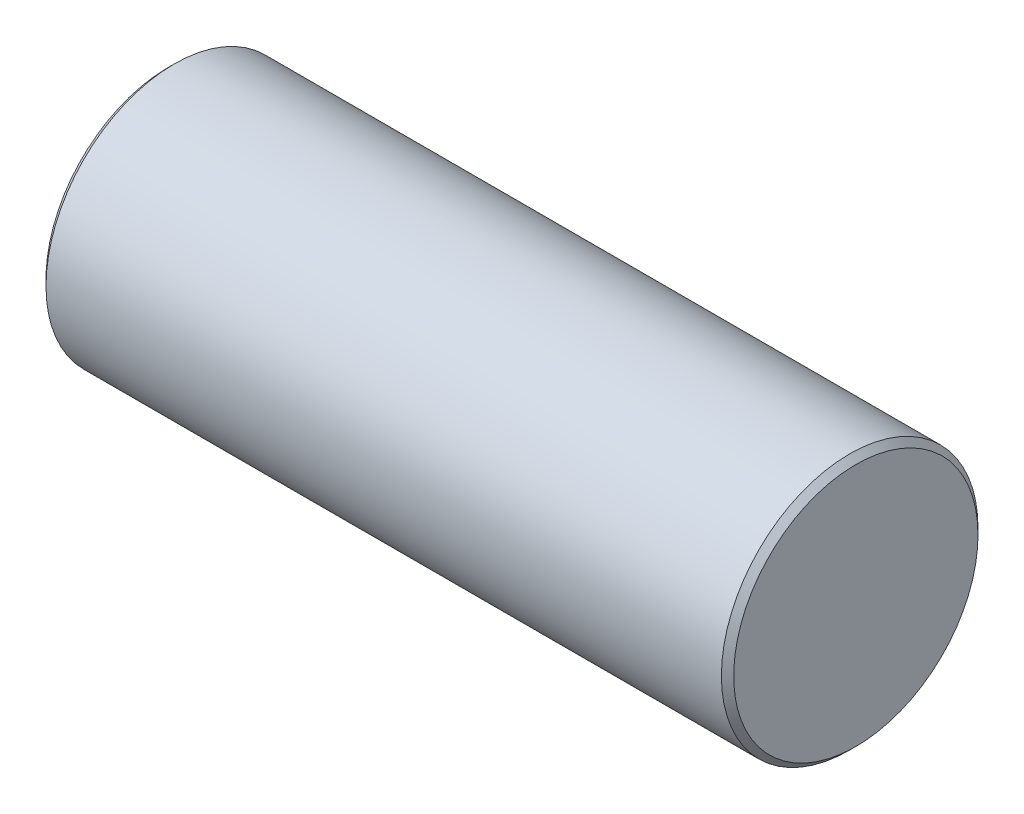
ISO-10303-21;
HEADER;
FILE_DESCRIPTION(('STEP AP214'),'2;1');
FILE_NAME('part.step','',(''),(''),'','','');
FILE_SCHEMA(('AUTOMOTIVE_DESIGN { 1 0 10303 214 1 1 1 1 }'));
ENDSEC;
DATA;
#1=APPLICATION_CONTEXT('core data for automotive mechanical design processes');
#2=APPLICATION_PROTOCOL_DEFINITION('international standard','automotive_design',2000,#1);
#3=PRODUCT_CONTEXT('',#1,'mechanical');
#4=PRODUCT('Part','Part','',(#3));
#5=PRODUCT_RELATED_PRODUCT_CATEGORY('part','',(#4));
#6=PRODUCT_DEFINITION_FORMATION('','',#4);
#7=PRODUCT_DEFINITION_CONTEXT('part definition',#1,'design');
#8=PRODUCT_DEFINITION('design','',#6,#7);
#9=PRODUCT_DEFINITION_SHAPE('','',#8);
#10=(LENGTH_UNIT() NAMED_UNIT(*) SI_UNIT(.MILLI.,.METRE.));
#11=(NAMED_UNIT(*) PLANE_ANGLE_UNIT() SI_UNIT($,.RADIAN.));
#12=(NAMED_UNIT(*) SI_UNIT($,.STERADIAN.) SOLID_ANGLE_UNIT());
#13=UNCERTAINTY_MEASURE_WITH_UNIT(LENGTH_MEASURE(1.E-05),#10,'distance_accuracy_value','');
#14=(GEOMETRIC_REPRESENTATION_CONTEXT(3) GLOBAL_UNCERTAINTY_ASSIGNED_CONTEXT((#13)) GLOBAL_UNIT_ASSIGNED_CONTEXT((#10,
#11,#12)) REPRESENTATION_CONTEXT('',''));
#15=CARTESIAN_POINT('',(0.,0.,0.));
#16=DIRECTION('',(0.,0.,1.));
#17=DIRECTION('',(1.,0.,0.));
#18=AXIS2_PLACEMENT_3D('',#15,#16,#17);
#19=CARTESIAN_POINT('',(42.545,0.,0.));
#20=DIRECTION('',(-1.,0.,0.));
#21=DIRECTION('',(0.,0.,1.));
#22=AXIS2_PLACEMENT_3D('',#19,#20,#21);
#23=CYLINDRICAL_SURFACE('',#22,15.875);
#24=CARTESIAN_POINT('',(-41.783,0.,0.));
#25=DIRECTION('',(1.,0.,0.));
#26=DIRECTION('',(0.,0.,-1.));
#27=AXIS2_PLACEMENT_3D('',#24,#25,#26);
#28=CIRCLE('',#27,15.875);
#29=CARTESIAN_POINT('',(-41.783,0.,-15.875));
#30=VERTEX_POINT('',#29);
#31=EDGE_CURVE('E55',#30,#30,#28,.T.);
#32=ORIENTED_EDGE('',*,*,#31,.T.);
#33=EDGE_LOOP('',(#32));
#34=FACE_BOUND('',#33,.T.);
#35=CARTESIAN_POINT('',(41.783,0.,0.));
#36=DIRECTION('',(1.,0.,0.));
#37=DIRECTION('',(0.,0.,-1.));
#38=AXIS2_PLACEMENT_3D('',#35,#36,#37);
#39=CIRCLE('',#38,15.875);
#40=CARTESIAN_POINT('',(41.783,0.,-15.875));
#41=VERTEX_POINT('',#40);
#42=EDGE_CURVE('E60',#41,#41,#39,.F.);
#43=ORIENTED_EDGE('',*,*,#42,.T.);
#44=EDGE_LOOP('',(#43));
#45=FACE_BOUND('',#44,.T.);
#46=ADVANCED_FACE('F41',(#34,#45),#23,.T.);
#47=CARTESIAN_POINT('',(42.545,0.,0.));
#48=DIRECTION('',(1.,0.,0.));
#49=DIRECTION('',(0.,0.,-1.));
#50=AXIS2_PLACEMENT_3D('',#47,#48,#49);
#51=PLANE('',#50);
#52=CARTESIAN_POINT('',(42.545,0.,0.));
#53=DIRECTION('',(1.,0.,0.));
#54=DIRECTION('',(0.,0.,-1.));
#55=AXIS2_PLACEMENT_3D('',#52,#53,#54);
#56=CIRCLE('',#55,15.113);
#57=CARTESIAN_POINT('',(42.545,0.,-15.113));
#58=VERTEX_POINT('',#57);
#59=EDGE_CURVE('E10',#58,#58,#56,.T.);
#60=ORIENTED_EDGE('',*,*,#59,.T.);
#61=EDGE_LOOP('',(#60));
#62=FACE_BOUND('',#61,.T.);
#63=ADVANCED_FACE('F77',(#62),#51,.T.);
#64=CARTESIAN_POINT('',(-42.545,0.,0.));
#65=DIRECTION('',(1.,0.,0.));
#66=DIRECTION('',(0.,0.,-1.));
#67=AXIS2_PLACEMENT_3D('',#64,#65,#66);
#68=PLANE('',#67);
#69=CARTESIAN_POINT('',(-42.545,0.,0.));
#70=DIRECTION('',(1.,0.,0.));
#71=DIRECTION('',(0.,0.,-1.));
#72=AXIS2_PLACEMENT_3D('',#69,#70,#71);
#73=CIRCLE('',#72,15.113);
#74=CARTESIAN_POINT('',(-42.545,0.,-15.113));
#75=VERTEX_POINT('',#74);
#76=EDGE_CURVE('E50',#75,#75,#73,.F.);
#77=ORIENTED_EDGE('',*,*,#76,.T.);
#78=EDGE_LOOP('',(#77));
#79=FACE_BOUND('',#78,.T.);
#80=ADVANCED_FACE('F74',(#79),#68,.F.);
#81=CARTESIAN_POINT('',(-41.783,0.,0.));
#82=DIRECTION('',(1.,0.,0.));
#83=DIRECTION('',(0.,0.,-1.));
#84=AXIS2_PLACEMENT_3D('',#81,#82,#83);
#85=CONICAL_SURFACE('',#84,15.875,0.785398163397446);
#86=ORIENTED_EDGE('',*,*,#76,.F.);
#87=EDGE_LOOP('',(#86));
#88=FACE_BOUND('',#87,.T.);
#89=ORIENTED_EDGE('',*,*,#31,.F.);
#90=EDGE_LOOP('',(#89));
#91=FACE_BOUND('',#90,.T.);
#92=ADVANCED_FACE('F70',(#88,#91),#85,.T.);
#93=CARTESIAN_POINT('',(42.545,0.,0.));
#94=DIRECTION('',(-1.,0.,0.));
#95=DIRECTION('',(0.,0.,1.));
#96=AXIS2_PLACEMENT_3D('',#93,#94,#95);
#97=CONICAL_SURFACE('',#96,15.113,0.785398163397442);
#98=ORIENTED_EDGE('',*,*,#42,.F.);
#99=EDGE_LOOP('',(#98));
#100=FACE_BOUND('',#99,.T.);
#101=ORIENTED_EDGE('',*,*,#59,.F.);
#102=EDGE_LOOP('',(#101));
#103=FACE_BOUND('',#102,.T.);
#104=ADVANCED_FACE('F44',(#100,#103),#97,.T.);
#105=CLOSED_SHELL('',(#46,#63,#80,#92,#104));
#106=MANIFOLD_SOLID_BREP('B2',#105);
#107=ADVANCED_BREP_SHAPE_REPRESENTATION('',(#18,#106),#14);
#108=SHAPE_DEFINITION_REPRESENTATION(#9,#107);
ENDSEC;
END-ISO-10303-21;
